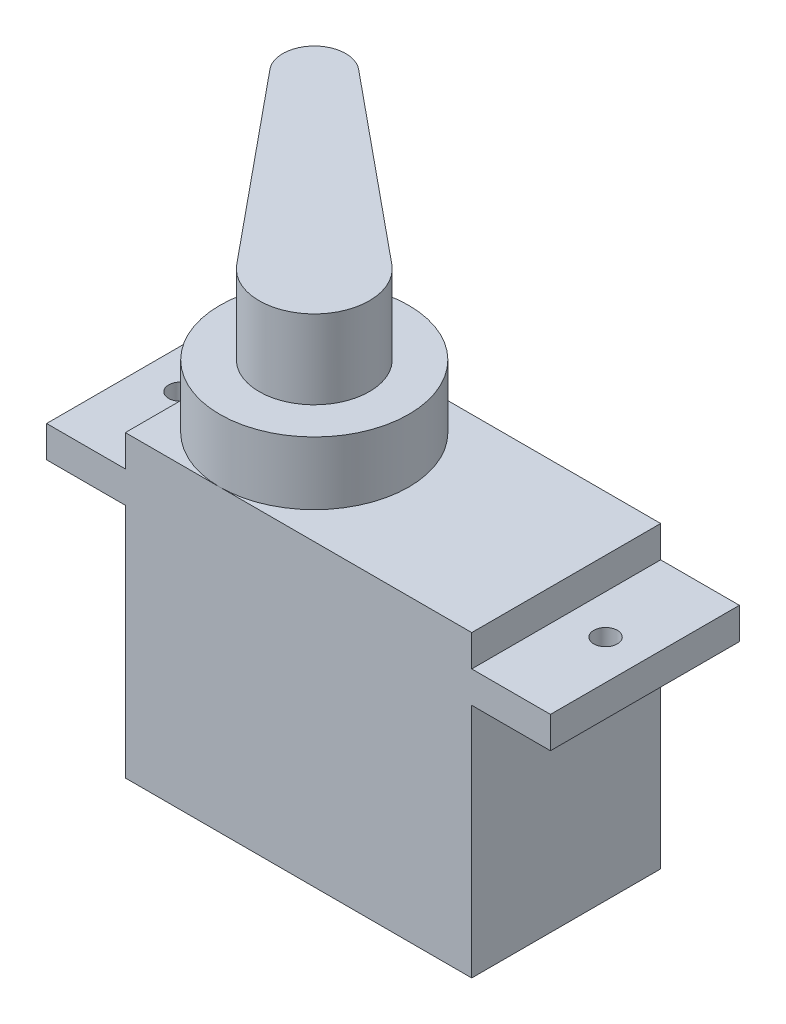
ISO-10303-21;
HEADER;
FILE_DESCRIPTION(('STEP AP214'),'2;1');
FILE_NAME('part.step','',(''),(''),'','','');
FILE_SCHEMA(('AUTOMOTIVE_DESIGN { 1 0 10303 214 1 1 1 1 }'));
ENDSEC;
DATA;
#1=APPLICATION_CONTEXT('core data for automotive mechanical design processes');
#2=APPLICATION_PROTOCOL_DEFINITION('international standard','automotive_design',2000,#1);
#3=PRODUCT_CONTEXT('',#1,'mechanical');
#4=PRODUCT('Part','Part','',(#3));
#5=PRODUCT_RELATED_PRODUCT_CATEGORY('part','',(#4));
#6=PRODUCT_DEFINITION_FORMATION('','',#4);
#7=PRODUCT_DEFINITION_CONTEXT('part definition',#1,'design');
#8=PRODUCT_DEFINITION('design','',#6,#7);
#9=PRODUCT_DEFINITION_SHAPE('','',#8);
#10=(LENGTH_UNIT() NAMED_UNIT(*) SI_UNIT(.MILLI.,.METRE.));
#11=(NAMED_UNIT(*) PLANE_ANGLE_UNIT() SI_UNIT($,.RADIAN.));
#12=(NAMED_UNIT(*) SI_UNIT($,.STERADIAN.) SOLID_ANGLE_UNIT());
#13=UNCERTAINTY_MEASURE_WITH_UNIT(LENGTH_MEASURE(1.E-05),#10,'distance_accuracy_value','');
#14=(GEOMETRIC_REPRESENTATION_CONTEXT(3) GLOBAL_UNCERTAINTY_ASSIGNED_CONTEXT((#13)) GLOBAL_UNIT_ASSIGNED_CONTEXT((#10,
#11,#12)) REPRESENTATION_CONTEXT('',''));
#15=CARTESIAN_POINT('',(0.,0.,0.));
#16=DIRECTION('',(0.,0.,1.));
#17=DIRECTION('',(1.,0.,0.));
#18=AXIS2_PLACEMENT_3D('',#15,#16,#17);
#19=CARTESIAN_POINT('',(-4.99999999999999,28.,0.));
#20=DIRECTION('',(0.,-1.,0.));
#21=DIRECTION('',(0.,0.,-1.));
#22=AXIS2_PLACEMENT_3D('',#19,#20,#21);
#23=CYLINDRICAL_SURFACE('',#22,3.5);
#24=CARTESIAN_POINT('',(-4.99999999999999,23.,0.));
#25=DIRECTION('',(0.,1.,0.));
#26=DIRECTION('',(0.,0.,1.));
#27=AXIS2_PLACEMENT_3D('',#24,#25,#26);
#28=CIRCLE('',#27,3.5);
#29=CARTESIAN_POINT('',(-4.99999999999999,23.,3.5));
#30=VERTEX_POINT('',#29);
#31=EDGE_CURVE('E196',#30,#30,#28,.T.);
#32=ORIENTED_EDGE('',*,*,#31,.T.);
#33=EDGE_LOOP('',(#32));
#34=FACE_BOUND('',#33,.T.);
#35=DIRECTION('',(0.,1.,0.));
#36=VECTOR('',#35,1.);
#37=CARTESIAN_POINT('',(-2.77895058963436,26.,-2.70498419897686));
#38=LINE('',#37,#36);
#39=CARTESIAN_POINT('',(-2.77895058963436,26.,-2.70498419897686));
#40=VERTEX_POINT('',#39);
#41=CARTESIAN_POINT('',(-2.77895058963436,28.,-2.70498419897686));
#42=VERTEX_POINT('',#41);
#43=EDGE_CURVE('E197',#40,#42,#38,.T.);
#44=ORIENTED_EDGE('',*,*,#43,.T.);
#45=CARTESIAN_POINT('',(-4.99999999999999,28.,0.));
#46=DIRECTION('',(0.,1.,0.));
#47=DIRECTION('',(0.,0.,1.));
#48=AXIS2_PLACEMENT_3D('',#45,#46,#47);
#49=CIRCLE('',#48,3.5);
#50=CARTESIAN_POINT('',(-7.70498419897683,28.,2.22104941036567));
#51=VERTEX_POINT('',#50);
#52=EDGE_CURVE('E201',#51,#42,#49,.T.);
#53=ORIENTED_EDGE('',*,*,#52,.F.);
#54=DIRECTION('',(0.,1.,0.));
#55=VECTOR('',#54,1.);
#56=CARTESIAN_POINT('',(-7.70498419897683,26.,2.22104941036567));
#57=LINE('',#56,#55);
#58=CARTESIAN_POINT('',(-7.70498419897683,26.,2.22104941036567));
#59=VERTEX_POINT('',#58);
#60=EDGE_CURVE('E176',#59,#51,#57,.T.);
#61=ORIENTED_EDGE('',*,*,#60,.F.);
#62=CARTESIAN_POINT('',(-4.99999999999999,26.,0.));
#63=DIRECTION('',(0.,1.,0.));
#64=DIRECTION('',(0.,0.,1.));
#65=AXIS2_PLACEMENT_3D('',#62,#63,#64);
#66=CIRCLE('',#65,3.5);
#67=EDGE_CURVE('E167',#40,#59,#66,.T.);
#68=ORIENTED_EDGE('',*,*,#67,.F.);
#69=EDGE_LOOP('',(#44,#53,#61,#68));
#70=FACE_BOUND('',#69,.T.);
#71=ADVANCED_FACE('F35',(#34,#70),#23,.T.);
#72=CARTESIAN_POINT('',(-4.99999999999999,23.,0.));
#73=DIRECTION('',(0.,1.,0.));
#74=DIRECTION('',(0.,0.,1.));
#75=AXIS2_PLACEMENT_3D('',#72,#73,#74);
#76=PLANE('',#75);
#77=CARTESIAN_POINT('',(-4.99999999999999,23.,0.));
#78=DIRECTION('',(0.,1.,0.));
#79=DIRECTION('',(0.,0.,1.));
#80=AXIS2_PLACEMENT_3D('',#77,#78,#79);
#81=CIRCLE('',#80,6.);
#82=CARTESIAN_POINT('',(-4.99999999999999,23.,6.));
#83=VERTEX_POINT('',#82);
#84=EDGE_CURVE('E205',#83,#83,#81,.T.);
#85=ORIENTED_EDGE('',*,*,#84,.T.);
#86=EDGE_LOOP('',(#85));
#87=FACE_BOUND('',#86,.T.);
#88=ORIENTED_EDGE('',*,*,#31,.F.);
#89=EDGE_LOOP('',(#88));
#90=FACE_BOUND('',#89,.T.);
#91=ADVANCED_FACE('F401',(#87,#90),#76,.T.);
#92=CARTESIAN_POINT('',(0.,19.,0.));
#93=DIRECTION('',(0.,-1.,0.));
#94=DIRECTION('',(0.,0.,-1.));
#95=AXIS2_PLACEMENT_3D('',#92,#93,#94);
#96=PLANE('',#95);
#97=CARTESIAN_POINT('',(-4.99999999999999,19.,0.));
#98=DIRECTION('',(0.,1.,0.));
#99=DIRECTION('',(0.,0.,1.));
#100=AXIS2_PLACEMENT_3D('',#97,#98,#99);
#101=CIRCLE('',#100,6.);
#102=CARTESIAN_POINT('',(-4.99999999999999,19.,6.));
#103=VERTEX_POINT('',#102);
#104=CARTESIAN_POINT('',(-4.99999999999999,19.,-6.));
#105=VERTEX_POINT('',#104);
#106=EDGE_CURVE('E46',#103,#105,#101,.T.);
#107=ORIENTED_EDGE('',*,*,#106,.F.);
#108=DIRECTION('',(1.,0.,0.));
#109=VECTOR('',#108,1.);
#110=CARTESIAN_POINT('',(-11.,19.,6.));
#111=LINE('',#110,#109);
#112=CARTESIAN_POINT('',(11.,19.,6.));
#113=VERTEX_POINT('',#112);
#114=EDGE_CURVE('E222',#103,#113,#111,.T.);
#115=ORIENTED_EDGE('',*,*,#114,.T.);
#116=DIRECTION('',(0.,0.,-1.));
#117=VECTOR('',#116,1.);
#118=CARTESIAN_POINT('',(11.,19.,6.));
#119=LINE('',#118,#117);
#120=CARTESIAN_POINT('',(11.,19.,-6.));
#121=VERTEX_POINT('',#120);
#122=EDGE_CURVE('E210',#113,#121,#119,.T.);
#123=ORIENTED_EDGE('',*,*,#122,.T.);
#124=DIRECTION('',(-1.,0.,0.));
#125=VECTOR('',#124,1.);
#126=CARTESIAN_POINT('',(-11.,19.,-6.));
#127=LINE('',#126,#125);
#128=EDGE_CURVE('E215',#121,#105,#127,.T.);
#129=ORIENTED_EDGE('',*,*,#128,.T.);
#130=EDGE_LOOP('',(#107,#115,#123,#129));
#131=FACE_BOUND('',#130,.T.);
#132=ADVANCED_FACE('F407',(#131),#96,.F.);
#133=CARTESIAN_POINT('',(-11.,19.,0.));
#134=VERTEX_POINT('',#133);
#135=EDGE_CURVE('E11',#105,#134,#101,.T.);
#136=ORIENTED_EDGE('',*,*,#135,.F.);
#137=CARTESIAN_POINT('',(-11.,19.,-6.));
#138=VERTEX_POINT('',#137);
#139=EDGE_CURVE('E213',#105,#138,#127,.T.);
#140=ORIENTED_EDGE('',*,*,#139,.T.);
#141=DIRECTION('',(0.,0.,1.));
#142=VECTOR('',#141,1.);
#143=CARTESIAN_POINT('',(-11.,19.,6.));
#144=LINE('',#143,#142);
#145=EDGE_CURVE('E219',#138,#134,#144,.T.);
#146=ORIENTED_EDGE('',*,*,#145,.T.);
#147=EDGE_LOOP('',(#136,#140,#146));
#148=FACE_BOUND('',#147,.T.);
#149=ADVANCED_FACE('F421',(#148),#96,.F.);
#150=EDGE_CURVE('E44',#134,#103,#101,.T.);
#151=ORIENTED_EDGE('',*,*,#150,.F.);
#152=CARTESIAN_POINT('',(-11.,19.,6.));
#153=VERTEX_POINT('',#152);
#154=EDGE_CURVE('E218',#134,#153,#144,.T.);
#155=ORIENTED_EDGE('',*,*,#154,.T.);
#156=EDGE_CURVE('E223',#153,#103,#111,.T.);
#157=ORIENTED_EDGE('',*,*,#156,.T.);
#158=EDGE_LOOP('',(#151,#155,#157));
#159=FACE_BOUND('',#158,.T.);
#160=ADVANCED_FACE('F423',(#159),#96,.F.);
#161=CARTESIAN_POINT('',(0.,17.,0.));
#162=DIRECTION('',(0.,-1.,0.));
#163=DIRECTION('',(0.,0.,-1.));
#164=AXIS2_PLACEMENT_3D('',#161,#162,#163);
#165=PLANE('',#164);
#166=CARTESIAN_POINT('',(13.5,17.,0.));
#167=DIRECTION('',(0.,1.,0.));
#168=DIRECTION('',(0.,0.,1.));
#169=AXIS2_PLACEMENT_3D('',#166,#167,#168);
#170=CIRCLE('',#169,0.75);
#171=CARTESIAN_POINT('',(13.5,17.,0.749999999999999));
#172=VERTEX_POINT('',#171);
#173=EDGE_CURVE('E193',#172,#172,#170,.T.);
#174=ORIENTED_EDGE('',*,*,#173,.F.);
#175=EDGE_LOOP('',(#174));
#176=FACE_BOUND('',#175,.T.);
#177=DIRECTION('',(0.,0.,-1.));
#178=VECTOR('',#177,1.);
#179=CARTESIAN_POINT('',(11.,17.,6.));
#180=LINE('',#179,#178);
#181=CARTESIAN_POINT('',(11.,17.,6.));
#182=VERTEX_POINT('',#181);
#183=CARTESIAN_POINT('',(11.,17.,-6.));
#184=VERTEX_POINT('',#183);
#185=EDGE_CURVE('E207',#182,#184,#180,.T.);
#186=ORIENTED_EDGE('',*,*,#185,.F.);
#187=DIRECTION('',(1.,0.,0.));
#188=VECTOR('',#187,1.);
#189=CARTESIAN_POINT('',(-16.,17.,6.));
#190=LINE('',#189,#188);
#191=CARTESIAN_POINT('',(16.,17.,6.));
#192=VERTEX_POINT('',#191);
#193=EDGE_CURVE('E349',#182,#192,#190,.T.);
#194=ORIENTED_EDGE('',*,*,#193,.T.);
#195=DIRECTION('',(0.,0.,-1.));
#196=VECTOR('',#195,1.);
#197=CARTESIAN_POINT('',(16.,17.,6.));
#198=LINE('',#197,#196);
#199=CARTESIAN_POINT('',(16.,17.,-6.));
#200=VERTEX_POINT('',#199);
#201=EDGE_CURVE('E347',#192,#200,#198,.T.);
#202=ORIENTED_EDGE('',*,*,#201,.T.);
#203=DIRECTION('',(-1.,0.,0.));
#204=VECTOR('',#203,1.);
#205=CARTESIAN_POINT('',(-16.,17.,-6.));
#206=LINE('',#205,#204);
#207=EDGE_CURVE('E340',#200,#184,#206,.T.);
#208=ORIENTED_EDGE('',*,*,#207,.T.);
#209=EDGE_LOOP('',(#186,#194,#202,#208));
#210=FACE_BOUND('',#209,.T.);
#211=ADVANCED_FACE('F429',(#176,#210),#165,.F.);
#212=CARTESIAN_POINT('',(-13.5,17.,0.));
#213=DIRECTION('',(0.,1.,0.));
#214=DIRECTION('',(0.,0.,1.));
#215=AXIS2_PLACEMENT_3D('',#212,#213,#214);
#216=CIRCLE('',#215,0.75);
#217=CARTESIAN_POINT('',(-13.5,17.,0.750000000000001));
#218=VERTEX_POINT('',#217);
#219=EDGE_CURVE('E441',#218,#218,#216,.T.);
#220=ORIENTED_EDGE('',*,*,#219,.F.);
#221=EDGE_LOOP('',(#220));
#222=FACE_BOUND('',#221,.T.);
#223=DIRECTION('',(0.,0.,1.));
#224=VECTOR('',#223,1.);
#225=CARTESIAN_POINT('',(-11.,17.,6.));
#226=LINE('',#225,#224);
#227=CARTESIAN_POINT('',(-11.,17.,-6.));
#228=VERTEX_POINT('',#227);
#229=CARTESIAN_POINT('',(-11.,17.,6.));
#230=VERTEX_POINT('',#229);
#231=EDGE_CURVE('E214',#228,#230,#226,.T.);
#232=ORIENTED_EDGE('',*,*,#231,.F.);
#233=CARTESIAN_POINT('',(-16.,17.,-6.));
#234=VERTEX_POINT('',#233);
#235=EDGE_CURVE('E344',#228,#234,#206,.T.);
#236=ORIENTED_EDGE('',*,*,#235,.T.);
#237=DIRECTION('',(0.,0.,1.));
#238=VECTOR('',#237,1.);
#239=CARTESIAN_POINT('',(-16.,17.,6.));
#240=LINE('',#239,#238);
#241=CARTESIAN_POINT('',(-16.,17.,6.));
#242=VERTEX_POINT('',#241);
#243=EDGE_CURVE('E343',#234,#242,#240,.T.);
#244=ORIENTED_EDGE('',*,*,#243,.T.);
#245=EDGE_CURVE('E292',#242,#230,#190,.T.);
#246=ORIENTED_EDGE('',*,*,#245,.T.);
#247=EDGE_LOOP('',(#232,#236,#244,#246));
#248=FACE_BOUND('',#247,.T.);
#249=ADVANCED_FACE('F358',(#222,#248),#165,.F.);
#250=CARTESIAN_POINT('',(11.,15.,6.));
#251=DIRECTION('',(-1.,0.,0.));
#252=DIRECTION('',(0.,0.,1.));
#253=AXIS2_PLACEMENT_3D('',#250,#251,#252);
#254=PLANE('',#253);
#255=DIRECTION('',(0.,0.,-1.));
#256=VECTOR('',#255,1.);
#257=CARTESIAN_POINT('',(11.,0.,6.));
#258=LINE('',#257,#256);
#259=CARTESIAN_POINT('',(11.,0.,6.));
#260=VERTEX_POINT('',#259);
#261=CARTESIAN_POINT('',(11.,0.,-6.));
#262=VERTEX_POINT('',#261);
#263=EDGE_CURVE('E299',#260,#262,#258,.T.);
#264=ORIENTED_EDGE('',*,*,#263,.T.);
#265=DIRECTION('',(0.,-1.,0.));
#266=VECTOR('',#265,1.);
#267=CARTESIAN_POINT('',(11.,15.,-6.));
#268=LINE('',#267,#266);
#269=CARTESIAN_POINT('',(11.,15.,-6.));
#270=VERTEX_POINT('',#269);
#271=EDGE_CURVE('E327',#270,#262,#268,.T.);
#272=ORIENTED_EDGE('',*,*,#271,.F.);
#273=DIRECTION('',(0.,0.,-1.));
#274=VECTOR('',#273,1.);
#275=CARTESIAN_POINT('',(11.,15.,6.));
#276=LINE('',#275,#274);
#277=CARTESIAN_POINT('',(11.,15.,6.));
#278=VERTEX_POINT('',#277);
#279=EDGE_CURVE('E314',#278,#270,#276,.T.);
#280=ORIENTED_EDGE('',*,*,#279,.F.);
#281=DIRECTION('',(0.,-1.,0.));
#282=VECTOR('',#281,1.);
#283=CARTESIAN_POINT('',(11.,15.,6.));
#284=LINE('',#283,#282);
#285=EDGE_CURVE('E319',#278,#260,#284,.T.);
#286=ORIENTED_EDGE('',*,*,#285,.T.);
#287=EDGE_LOOP('',(#264,#272,#280,#286));
#288=FACE_BOUND('',#287,.T.);
#289=ADVANCED_FACE('F37',(#288),#254,.F.);
#290=CARTESIAN_POINT('',(-11.,15.,-6.));
#291=DIRECTION('',(0.,0.,1.));
#292=DIRECTION('',(1.,0.,0.));
#293=AXIS2_PLACEMENT_3D('',#290,#291,#292);
#294=PLANE('',#293);
#295=DIRECTION('',(-1.,0.,0.));
#296=VECTOR('',#295,1.);
#297=CARTESIAN_POINT('',(-11.,0.,-6.));
#298=LINE('',#297,#296);
#299=CARTESIAN_POINT('',(-11.,0.,-6.));
#300=VERTEX_POINT('',#299);
#301=EDGE_CURVE('E301',#262,#300,#298,.T.);
#302=ORIENTED_EDGE('',*,*,#301,.T.);
#303=DIRECTION('',(0.,-1.,0.));
#304=VECTOR('',#303,1.);
#305=CARTESIAN_POINT('',(-11.,15.,-6.));
#306=LINE('',#305,#304);
#307=CARTESIAN_POINT('',(-11.,15.,-6.));
#308=VERTEX_POINT('',#307);
#309=EDGE_CURVE('E318',#308,#300,#306,.T.);
#310=ORIENTED_EDGE('',*,*,#309,.F.);
#311=DIRECTION('',(-1.,0.,0.));
#312=VECTOR('',#311,1.);
#313=CARTESIAN_POINT('',(-16.,15.,-6.));
#314=LINE('',#313,#312);
#315=CARTESIAN_POINT('',(-16.,15.,-6.));
#316=VERTEX_POINT('',#315);
#317=EDGE_CURVE('E261',#308,#316,#314,.T.);
#318=ORIENTED_EDGE('',*,*,#317,.T.);
#319=DIRECTION('',(0.,-1.,0.));
#320=VECTOR('',#319,1.);
#321=CARTESIAN_POINT('',(-16.,17.,-6.));
#322=LINE('',#321,#320);
#323=EDGE_CURVE('E295',#234,#316,#322,.T.);
#324=ORIENTED_EDGE('',*,*,#323,.F.);
#325=ORIENTED_EDGE('',*,*,#235,.F.);
#326=DIRECTION('',(0.,-1.,0.));
#327=VECTOR('',#326,1.);
#328=CARTESIAN_POINT('',(-11.,19.,-6.));
#329=LINE('',#328,#327);
#330=EDGE_CURVE('E241',#138,#228,#329,.T.);
#331=ORIENTED_EDGE('',*,*,#330,.F.);
#332=ORIENTED_EDGE('',*,*,#139,.F.);
#333=ORIENTED_EDGE('',*,*,#128,.F.);
#334=DIRECTION('',(0.,-1.,0.));
#335=VECTOR('',#334,1.);
#336=CARTESIAN_POINT('',(11.,19.,-6.));
#337=LINE('',#336,#335);
#338=EDGE_CURVE('E248',#121,#184,#337,.T.);
#339=ORIENTED_EDGE('',*,*,#338,.T.);
#340=ORIENTED_EDGE('',*,*,#207,.F.);
#341=DIRECTION('',(0.,-1.,0.));
#342=VECTOR('',#341,1.);
#343=CARTESIAN_POINT('',(16.,17.,-6.));
#344=LINE('',#343,#342);
#345=CARTESIAN_POINT('',(16.,15.,-6.));
#346=VERTEX_POINT('',#345);
#347=EDGE_CURVE('E297',#200,#346,#344,.T.);
#348=ORIENTED_EDGE('',*,*,#347,.T.);
#349=EDGE_CURVE('E267',#346,#270,#314,.T.);
#350=ORIENTED_EDGE('',*,*,#349,.T.);
#351=ORIENTED_EDGE('',*,*,#271,.T.);
#352=EDGE_LOOP('',(#302,#310,#318,#324,#325,#331,#332,#333,#339,#340,#348,#350,#351));
#353=FACE_BOUND('',#352,.T.);
#354=ADVANCED_FACE('F365',(#353),#294,.F.);
#355=CARTESIAN_POINT('',(-11.,15.,6.));
#356=DIRECTION('',(1.,0.,0.));
#357=DIRECTION('',(0.,0.,-1.));
#358=AXIS2_PLACEMENT_3D('',#355,#356,#357);
#359=PLANE('',#358);
#360=DIRECTION('',(0.,0.,1.));
#361=VECTOR('',#360,1.);
#362=CARTESIAN_POINT('',(-11.,0.,6.));
#363=LINE('',#362,#361);
#364=CARTESIAN_POINT('',(-11.,0.,6.));
#365=VERTEX_POINT('',#364);
#366=EDGE_CURVE('E306',#300,#365,#363,.T.);
#367=ORIENTED_EDGE('',*,*,#366,.T.);
#368=DIRECTION('',(0.,-1.,0.));
#369=VECTOR('',#368,1.);
#370=CARTESIAN_POINT('',(-11.,15.,6.));
#371=LINE('',#370,#369);
#372=CARTESIAN_POINT('',(-11.,15.,6.));
#373=VERTEX_POINT('',#372);
#374=EDGE_CURVE('E315',#373,#365,#371,.T.);
#375=ORIENTED_EDGE('',*,*,#374,.F.);
#376=DIRECTION('',(0.,0.,1.));
#377=VECTOR('',#376,1.);
#378=CARTESIAN_POINT('',(-11.,15.,6.));
#379=LINE('',#378,#377);
#380=EDGE_CURVE('E322',#308,#373,#379,.T.);
#381=ORIENTED_EDGE('',*,*,#380,.F.);
#382=ORIENTED_EDGE('',*,*,#309,.T.);
#383=EDGE_LOOP('',(#367,#375,#381,#382));
#384=FACE_BOUND('',#383,.T.);
#385=ADVANCED_FACE('F378',(#384),#359,.F.);
#386=CARTESIAN_POINT('',(-11.,15.,6.));
#387=DIRECTION('',(0.,0.,-1.));
#388=DIRECTION('',(-1.,0.,0.));
#389=AXIS2_PLACEMENT_3D('',#386,#387,#388);
#390=PLANE('',#389);
#391=DIRECTION('',(1.,0.,0.));
#392=VECTOR('',#391,1.);
#393=CARTESIAN_POINT('',(-11.,0.,6.));
#394=LINE('',#393,#392);
#395=EDGE_CURVE('E312',#365,#260,#394,.T.);
#396=ORIENTED_EDGE('',*,*,#395,.T.);
#397=ORIENTED_EDGE('',*,*,#285,.F.);
#398=DIRECTION('',(1.,0.,0.));
#399=VECTOR('',#398,1.);
#400=CARTESIAN_POINT('',(-16.,15.,6.));
#401=LINE('',#400,#399);
#402=CARTESIAN_POINT('',(16.,15.,6.));
#403=VERTEX_POINT('',#402);
#404=EDGE_CURVE('E282',#278,#403,#401,.T.);
#405=ORIENTED_EDGE('',*,*,#404,.T.);
#406=DIRECTION('',(0.,-1.,0.));
#407=VECTOR('',#406,1.);
#408=CARTESIAN_POINT('',(16.,17.,6.));
#409=LINE('',#408,#407);
#410=EDGE_CURVE('E288',#192,#403,#409,.T.);
#411=ORIENTED_EDGE('',*,*,#410,.F.);
#412=ORIENTED_EDGE('',*,*,#193,.F.);
#413=DIRECTION('',(0.,-1.,0.));
#414=VECTOR('',#413,1.);
#415=CARTESIAN_POINT('',(11.,19.,6.));
#416=LINE('',#415,#414);
#417=EDGE_CURVE('E225',#113,#182,#416,.T.);
#418=ORIENTED_EDGE('',*,*,#417,.F.);
#419=ORIENTED_EDGE('',*,*,#114,.F.);
#420=ORIENTED_EDGE('',*,*,#156,.F.);
#421=DIRECTION('',(0.,-1.,0.));
#422=VECTOR('',#421,1.);
#423=CARTESIAN_POINT('',(-11.,19.,6.));
#424=LINE('',#423,#422);
#425=EDGE_CURVE('E236',#153,#230,#424,.T.);
#426=ORIENTED_EDGE('',*,*,#425,.T.);
#427=ORIENTED_EDGE('',*,*,#245,.F.);
#428=DIRECTION('',(0.,-1.,0.));
#429=VECTOR('',#428,1.);
#430=CARTESIAN_POINT('',(-16.,17.,6.));
#431=LINE('',#430,#429);
#432=CARTESIAN_POINT('',(-16.,15.,6.));
#433=VERTEX_POINT('',#432);
#434=EDGE_CURVE('E291',#242,#433,#431,.T.);
#435=ORIENTED_EDGE('',*,*,#434,.T.);
#436=EDGE_CURVE('E284',#433,#373,#401,.T.);
#437=ORIENTED_EDGE('',*,*,#436,.T.);
#438=ORIENTED_EDGE('',*,*,#374,.T.);
#439=EDGE_LOOP('',(#396,#397,#405,#411,#412,#418,#419,#420,#426,#427,#435,#437,#438));
#440=FACE_BOUND('',#439,.T.);
#441=ADVANCED_FACE('F370',(#440),#390,.F.);
#442=CARTESIAN_POINT('',(0.,0.,0.));
#443=DIRECTION('',(0.,-1.,0.));
#444=DIRECTION('',(0.,0.,-1.));
#445=AXIS2_PLACEMENT_3D('',#442,#443,#444);
#446=PLANE('',#445);
#447=ORIENTED_EDGE('',*,*,#263,.F.);
#448=ORIENTED_EDGE('',*,*,#395,.F.);
#449=ORIENTED_EDGE('',*,*,#366,.F.);
#450=ORIENTED_EDGE('',*,*,#301,.F.);
#451=EDGE_LOOP('',(#447,#448,#449,#450));
#452=FACE_BOUND('',#451,.T.);
#453=ADVANCED_FACE('F381',(#452),#446,.T.);
#454=CARTESIAN_POINT('',(0.,15.,0.));
#455=DIRECTION('',(0.,-1.,0.));
#456=DIRECTION('',(0.,0.,-1.));
#457=AXIS2_PLACEMENT_3D('',#454,#455,#456);
#458=PLANE('',#457);
#459=CARTESIAN_POINT('',(13.5,15.,0.));
#460=DIRECTION('',(0.,-1.,0.));
#461=DIRECTION('',(0.,0.,-1.));
#462=AXIS2_PLACEMENT_3D('',#459,#460,#461);
#463=CIRCLE('',#462,0.75);
#464=CARTESIAN_POINT('',(13.5,15.,-0.750000000000002));
#465=VERTEX_POINT('',#464);
#466=EDGE_CURVE('E186',#465,#465,#463,.F.);
#467=ORIENTED_EDGE('',*,*,#466,.T.);
#468=EDGE_LOOP('',(#467));
#469=FACE_BOUND('',#468,.T.);
#470=ORIENTED_EDGE('',*,*,#404,.F.);
#471=ORIENTED_EDGE('',*,*,#279,.T.);
#472=ORIENTED_EDGE('',*,*,#349,.F.);
#473=DIRECTION('',(0.,0.,-1.));
#474=VECTOR('',#473,1.);
#475=CARTESIAN_POINT('',(16.,15.,6.));
#476=LINE('',#475,#474);
#477=EDGE_CURVE('E257',#403,#346,#476,.T.);
#478=ORIENTED_EDGE('',*,*,#477,.F.);
#479=EDGE_LOOP('',(#470,#471,#472,#478));
#480=FACE_BOUND('',#479,.T.);
#481=ADVANCED_FACE('F385',(#469,#480),#458,.T.);
#482=CARTESIAN_POINT('',(16.,17.,6.));
#483=DIRECTION('',(-1.,0.,0.));
#484=DIRECTION('',(0.,0.,1.));
#485=AXIS2_PLACEMENT_3D('',#482,#483,#484);
#486=PLANE('',#485);
#487=ORIENTED_EDGE('',*,*,#477,.T.);
#488=ORIENTED_EDGE('',*,*,#347,.F.);
#489=ORIENTED_EDGE('',*,*,#201,.F.);
#490=ORIENTED_EDGE('',*,*,#410,.T.);
#491=EDGE_LOOP('',(#487,#488,#489,#490));
#492=FACE_BOUND('',#491,.T.);
#493=ADVANCED_FACE('F386',(#492),#486,.F.);
#494=CARTESIAN_POINT('',(-16.,17.,6.));
#495=DIRECTION('',(1.,0.,0.));
#496=DIRECTION('',(0.,0.,-1.));
#497=AXIS2_PLACEMENT_3D('',#494,#495,#496);
#498=PLANE('',#497);
#499=DIRECTION('',(0.,0.,1.));
#500=VECTOR('',#499,1.);
#501=CARTESIAN_POINT('',(-16.,15.,6.));
#502=LINE('',#501,#500);
#503=EDGE_CURVE('E275',#316,#433,#502,.T.);
#504=ORIENTED_EDGE('',*,*,#503,.T.);
#505=ORIENTED_EDGE('',*,*,#434,.F.);
#506=ORIENTED_EDGE('',*,*,#243,.F.);
#507=ORIENTED_EDGE('',*,*,#323,.T.);
#508=EDGE_LOOP('',(#504,#505,#506,#507));
#509=FACE_BOUND('',#508,.T.);
#510=ADVANCED_FACE('F388',(#509),#498,.F.);
#511=CARTESIAN_POINT('',(-13.5,15.,0.));
#512=DIRECTION('',(0.,-1.,0.));
#513=DIRECTION('',(0.,0.,-1.));
#514=AXIS2_PLACEMENT_3D('',#511,#512,#513);
#515=CIRCLE('',#514,0.75);
#516=CARTESIAN_POINT('',(-13.5,15.,-0.749999999999999));
#517=VERTEX_POINT('',#516);
#518=EDGE_CURVE('E439',#517,#517,#515,.F.);
#519=ORIENTED_EDGE('',*,*,#518,.T.);
#520=EDGE_LOOP('',(#519));
#521=FACE_BOUND('',#520,.T.);
#522=ORIENTED_EDGE('',*,*,#317,.F.);
#523=ORIENTED_EDGE('',*,*,#380,.T.);
#524=ORIENTED_EDGE('',*,*,#436,.F.);
#525=ORIENTED_EDGE('',*,*,#503,.F.);
#526=EDGE_LOOP('',(#522,#523,#524,#525));
#527=FACE_BOUND('',#526,.T.);
#528=ADVANCED_FACE('F375',(#521,#527),#458,.T.);
#529=CARTESIAN_POINT('',(11.,19.,6.));
#530=DIRECTION('',(-1.,0.,0.));
#531=DIRECTION('',(0.,0.,1.));
#532=AXIS2_PLACEMENT_3D('',#529,#530,#531);
#533=PLANE('',#532);
#534=ORIENTED_EDGE('',*,*,#185,.T.);
#535=ORIENTED_EDGE('',*,*,#338,.F.);
#536=ORIENTED_EDGE('',*,*,#122,.F.);
#537=ORIENTED_EDGE('',*,*,#417,.T.);
#538=EDGE_LOOP('',(#534,#535,#536,#537));
#539=FACE_BOUND('',#538,.T.);
#540=ADVANCED_FACE('F426',(#539),#533,.F.);
#541=CARTESIAN_POINT('',(-11.,19.,6.));
#542=DIRECTION('',(1.,0.,0.));
#543=DIRECTION('',(0.,0.,-1.));
#544=AXIS2_PLACEMENT_3D('',#541,#542,#543);
#545=PLANE('',#544);
#546=ORIENTED_EDGE('',*,*,#231,.T.);
#547=ORIENTED_EDGE('',*,*,#425,.F.);
#548=ORIENTED_EDGE('',*,*,#154,.F.);
#549=ORIENTED_EDGE('',*,*,#145,.F.);
#550=ORIENTED_EDGE('',*,*,#330,.T.);
#551=EDGE_LOOP('',(#546,#547,#548,#549,#550));
#552=FACE_BOUND('',#551,.T.);
#553=ADVANCED_FACE('F361',(#552),#545,.F.);
#554=CARTESIAN_POINT('',(-4.99999999999999,23.,0.));
#555=DIRECTION('',(0.,-1.,0.));
#556=DIRECTION('',(0.,0.,-1.));
#557=AXIS2_PLACEMENT_3D('',#554,#555,#556);
#558=CYLINDRICAL_SURFACE('',#557,6.);
#559=ORIENTED_EDGE('',*,*,#84,.F.);
#560=EDGE_LOOP('',(#559));
#561=FACE_BOUND('',#560,.T.);
#562=ORIENTED_EDGE('',*,*,#106,.T.);
#563=ORIENTED_EDGE('',*,*,#135,.T.);
#564=ORIENTED_EDGE('',*,*,#150,.T.);
#565=EDGE_LOOP('',(#562,#563,#564));
#566=FACE_BOUND('',#565,.T.);
#567=ADVANCED_FACE('F415',(#561,#566),#558,.T.);
#568=CARTESIAN_POINT('',(-4.99999999999999,28.,0.));
#569=DIRECTION('',(0.,1.,0.));
#570=DIRECTION('',(0.,0.,1.));
#571=AXIS2_PLACEMENT_3D('',#568,#569,#570);
#572=PLANE('',#571);
#573=ORIENTED_EDGE('',*,*,#52,.T.);
#574=DIRECTION('',(0.772852628279102,0.,0.634585545818753));
#575=VECTOR('',#574,1.);
#576=CARTESIAN_POINT('',(0.207555335555215,28.,-0.252778664207102));
#577=LINE('',#576,#575);
#578=CARTESIAN_POINT('',(-14.5793980204663,28.,-12.394274368662));
#579=VERTEX_POINT('',#578);
#580=EDGE_CURVE('E182',#579,#42,#577,.T.);
#581=ORIENTED_EDGE('',*,*,#580,.F.);
#582=CARTESIAN_POINT('',(-15.8485691121039,28.,-10.8485691121037));
#583=DIRECTION('',(0.,1.,0.));
#584=DIRECTION('',(0.,0.,1.));
#585=AXIS2_PLACEMENT_3D('',#582,#583,#584);
#586=CIRCLE('',#585,2.00000000000003);
#587=CARTESIAN_POINT('',(-17.3942743686621,28.,-9.57939802046621));
#588=VERTEX_POINT('',#587);
#589=EDGE_CURVE('E191',#588,#579,#586,.F.);
#590=ORIENTED_EDGE('',*,*,#589,.F.);
#591=DIRECTION('',(-0.634585545818761,0.,-0.772852628279095));
#592=VECTOR('',#591,1.);
#593=CARTESIAN_POINT('',(-5.69149012416635,28.,4.67325494513543));
#594=LINE('',#593,#592);
#595=EDGE_CURVE('E53',#51,#588,#594,.T.);
#596=ORIENTED_EDGE('',*,*,#595,.F.);
#597=EDGE_LOOP('',(#573,#581,#590,#596));
#598=FACE_BOUND('',#597,.T.);
#599=ADVANCED_FACE('F412',(#598),#572,.T.);
#600=CARTESIAN_POINT('',(-15.8485691121039,26.,-10.8485691121037));
#601=DIRECTION('',(0.,1.,0.));
#602=DIRECTION('',(0.,0.,1.));
#603=AXIS2_PLACEMENT_3D('',#600,#601,#602);
#604=CYLINDRICAL_SURFACE('',#603,2.00000000000003);
#605=ORIENTED_EDGE('',*,*,#589,.T.);
#606=DIRECTION('',(0.,1.,0.));
#607=VECTOR('',#606,1.);
#608=CARTESIAN_POINT('',(-14.5793980204663,26.,-12.394274368662));
#609=LINE('',#608,#607);
#610=CARTESIAN_POINT('',(-14.5793980204663,26.,-12.394274368662));
#611=VERTEX_POINT('',#610);
#612=EDGE_CURVE('E181',#611,#579,#609,.T.);
#613=ORIENTED_EDGE('',*,*,#612,.F.);
#614=CARTESIAN_POINT('',(-15.8485691121039,26.,-10.8485691121037));
#615=DIRECTION('',(0.,1.,0.));
#616=DIRECTION('',(0.,0.,1.));
#617=AXIS2_PLACEMENT_3D('',#614,#615,#616);
#618=CIRCLE('',#617,2.00000000000003);
#619=CARTESIAN_POINT('',(-17.3942743686621,26.,-9.57939802046621));
#620=VERTEX_POINT('',#619);
#621=EDGE_CURVE('E164',#620,#611,#618,.F.);
#622=ORIENTED_EDGE('',*,*,#621,.F.);
#623=DIRECTION('',(0.,1.,0.));
#624=VECTOR('',#623,1.);
#625=CARTESIAN_POINT('',(-17.3942743686621,26.,-9.57939802046621));
#626=LINE('',#625,#624);
#627=EDGE_CURVE('E172',#620,#588,#626,.T.);
#628=ORIENTED_EDGE('',*,*,#627,.T.);
#629=EDGE_LOOP('',(#605,#613,#622,#628));
#630=FACE_BOUND('',#629,.T.);
#631=ADVANCED_FACE('F179',(#630),#604,.T.);
#632=CARTESIAN_POINT('',(0.207555335555215,26.,-0.252778664207102));
#633=DIRECTION('',(-0.634585545818753,0.,0.772852628279102));
#634=DIRECTION('',(0.772852628279102,0.,0.634585545818753));
#635=AXIS2_PLACEMENT_3D('',#632,#633,#634);
#636=PLANE('',#635);
#637=ORIENTED_EDGE('',*,*,#580,.T.);
#638=ORIENTED_EDGE('',*,*,#43,.F.);
#639=DIRECTION('',(0.772852628279102,0.,0.634585545818753));
#640=VECTOR('',#639,1.);
#641=CARTESIAN_POINT('',(0.207555335555215,26.,-0.252778664207102));
#642=LINE('',#641,#640);
#643=EDGE_CURVE('E177',#611,#40,#642,.T.);
#644=ORIENTED_EDGE('',*,*,#643,.F.);
#645=ORIENTED_EDGE('',*,*,#612,.T.);
#646=EDGE_LOOP('',(#637,#638,#644,#645));
#647=FACE_BOUND('',#646,.T.);
#648=ADVANCED_FACE('F461',(#647),#636,.F.);
#649=CARTESIAN_POINT('',(-5.69149012416635,26.,4.67325494513543));
#650=DIRECTION('',(0.772852628279095,0.,-0.634585545818761));
#651=DIRECTION('',(-0.634585545818761,0.,-0.772852628279095));
#652=AXIS2_PLACEMENT_3D('',#649,#650,#651);
#653=PLANE('',#652);
#654=ORIENTED_EDGE('',*,*,#595,.T.);
#655=ORIENTED_EDGE('',*,*,#627,.F.);
#656=DIRECTION('',(-0.634585545818761,0.,-0.772852628279095));
#657=VECTOR('',#656,1.);
#658=CARTESIAN_POINT('',(-5.69149012416635,26.,4.67325494513543));
#659=LINE('',#658,#657);
#660=EDGE_CURVE('E160',#59,#620,#659,.T.);
#661=ORIENTED_EDGE('',*,*,#660,.F.);
#662=ORIENTED_EDGE('',*,*,#60,.T.);
#663=EDGE_LOOP('',(#654,#655,#661,#662));
#664=FACE_BOUND('',#663,.T.);
#665=ADVANCED_FACE('F173',(#664),#653,.F.);
#666=CARTESIAN_POINT('',(0.,26.,0.));
#667=DIRECTION('',(0.,1.,0.));
#668=DIRECTION('',(0.,0.,1.));
#669=AXIS2_PLACEMENT_3D('',#666,#667,#668);
#670=PLANE('',#669);
#671=ORIENTED_EDGE('',*,*,#621,.T.);
#672=ORIENTED_EDGE('',*,*,#643,.T.);
#673=ORIENTED_EDGE('',*,*,#67,.T.);
#674=ORIENTED_EDGE('',*,*,#660,.T.);
#675=EDGE_LOOP('',(#671,#672,#673,#674));
#676=FACE_BOUND('',#675,.T.);
#677=ADVANCED_FACE('F162',(#676),#670,.F.);
#678=CARTESIAN_POINT('',(13.5,-0.00102500000000172,0.));
#679=DIRECTION('',(0.,1.,0.));
#680=DIRECTION('',(0.,0.,1.));
#681=AXIS2_PLACEMENT_3D('',#678,#679,#680);
#682=CYLINDRICAL_SURFACE('',#681,0.75);
#683=ORIENTED_EDGE('',*,*,#466,.F.);
#684=EDGE_LOOP('',(#683));
#685=FACE_BOUND('',#684,.T.);
#686=ORIENTED_EDGE('',*,*,#173,.T.);
#687=EDGE_LOOP('',(#686));
#688=FACE_BOUND('',#687,.T.);
#689=ADVANCED_FACE('F451',(#685,#688),#682,.F.);
#690=CARTESIAN_POINT('',(-13.5,-0.00102500000000172,0.));
#691=DIRECTION('',(0.,1.,0.));
#692=DIRECTION('',(0.,0.,1.));
#693=AXIS2_PLACEMENT_3D('',#690,#691,#692);
#694=CYLINDRICAL_SURFACE('',#693,0.75);
#695=ORIENTED_EDGE('',*,*,#518,.F.);
#696=EDGE_LOOP('',(#695));
#697=FACE_BOUND('',#696,.T.);
#698=ORIENTED_EDGE('',*,*,#219,.T.);
#699=EDGE_LOOP('',(#698));
#700=FACE_BOUND('',#699,.T.);
#701=ADVANCED_FACE('F453',(#697,#700),#694,.F.);
#702=CLOSED_SHELL('',(#71,#91,#132,#149,#160,#211,#249,#289,#354,#385,#441,#453,#481,#493,#510,
#528,#540,#553,#567,#599,#631,#648,#665,#677,#689,#701));
#703=MANIFOLD_SOLID_BREP('B2',#702);
#704=ADVANCED_BREP_SHAPE_REPRESENTATION('',(#18,#703),#14);
#705=SHAPE_DEFINITION_REPRESENTATION(#9,#704);
ENDSEC;
END-ISO-10303-21;
